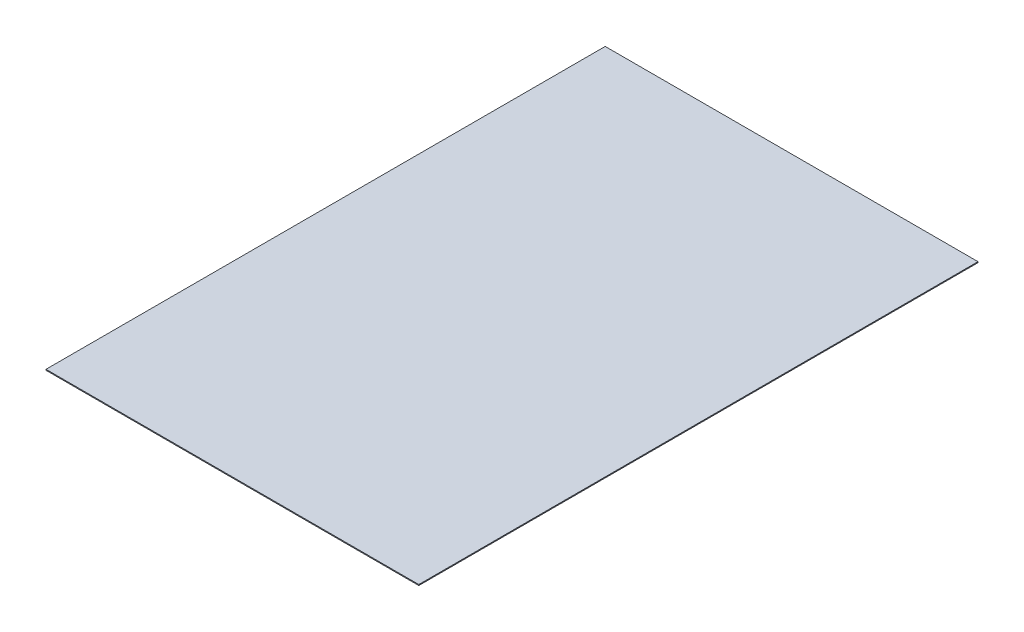
ISO-10303-21;
HEADER;
FILE_DESCRIPTION(('STEP AP214'),'2;1');
FILE_NAME('part.step','',(''),(''),'','','');
FILE_SCHEMA(('AUTOMOTIVE_DESIGN { 1 0 10303 214 1 1 1 1 }'));
ENDSEC;
DATA;
#1=APPLICATION_CONTEXT('core data for automotive mechanical design processes');
#2=APPLICATION_PROTOCOL_DEFINITION('international standard','automotive_design',2000,#1);
#3=PRODUCT_CONTEXT('',#1,'mechanical');
#4=PRODUCT('Part','Part','',(#3));
#5=PRODUCT_RELATED_PRODUCT_CATEGORY('part','',(#4));
#6=PRODUCT_DEFINITION_FORMATION('','',#4);
#7=PRODUCT_DEFINITION_CONTEXT('part definition',#1,'design');
#8=PRODUCT_DEFINITION('design','',#6,#7);
#9=PRODUCT_DEFINITION_SHAPE('','',#8);
#10=(LENGTH_UNIT() NAMED_UNIT(*) SI_UNIT(.MILLI.,.METRE.));
#11=(NAMED_UNIT(*) PLANE_ANGLE_UNIT() SI_UNIT($,.RADIAN.));
#12=(NAMED_UNIT(*) SI_UNIT($,.STERADIAN.) SOLID_ANGLE_UNIT());
#13=UNCERTAINTY_MEASURE_WITH_UNIT(LENGTH_MEASURE(1.E-05),#10,'distance_accuracy_value','');
#14=(GEOMETRIC_REPRESENTATION_CONTEXT(3) GLOBAL_UNCERTAINTY_ASSIGNED_CONTEXT((#13)) GLOBAL_UNIT_ASSIGNED_CONTEXT((#10,
#11,#12)) REPRESENTATION_CONTEXT('',''));
#15=CARTESIAN_POINT('',(0.,0.,0.));
#16=DIRECTION('',(0.,0.,1.));
#17=DIRECTION('',(1.,0.,0.));
#18=AXIS2_PLACEMENT_3D('',#15,#16,#17);
#19=CARTESIAN_POINT('',(-500.,2.5,750.));
#20=DIRECTION('',(0.,1.,0.));
#21=DIRECTION('',(1.,0.,0.));
#22=AXIS2_PLACEMENT_3D('',#19,#20,#21);
#23=PLANE('',#22);
#24=DIRECTION('',(0.,0.,1.));
#25=VECTOR('',#24,1.);
#26=CARTESIAN_POINT('',(4.20264305523982E-13,2.5,1500.));
#27=LINE('',#26,#25);
#28=CARTESIAN_POINT('',(0.,2.5,0.));
#29=VERTEX_POINT('',#28);
#30=CARTESIAN_POINT('',(4.20264305523982E-13,2.5,1500.));
#31=VERTEX_POINT('',#30);
#32=EDGE_CURVE('E108',#29,#31,#27,.T.);
#33=ORIENTED_EDGE('',*,*,#32,.F.);
#34=DIRECTION('',(1.,0.,0.));
#35=VECTOR('',#34,1.);
#36=CARTESIAN_POINT('',(0.,2.5,0.));
#37=LINE('',#36,#35);
#38=CARTESIAN_POINT('',(-1000.,2.5,0.));
#39=VERTEX_POINT('',#38);
#40=EDGE_CURVE('E28',#39,#29,#37,.T.);
#41=ORIENTED_EDGE('',*,*,#40,.F.);
#42=DIRECTION('',(0.,0.,-1.));
#43=VECTOR('',#42,1.);
#44=CARTESIAN_POINT('',(-1000.,2.5,0.));
#45=LINE('',#44,#43);
#46=CARTESIAN_POINT('',(-1000.,2.5,1500.));
#47=VERTEX_POINT('',#46);
#48=EDGE_CURVE('E74',#47,#39,#45,.T.);
#49=ORIENTED_EDGE('',*,*,#48,.F.);
#50=DIRECTION('',(-1.,0.,0.));
#51=VECTOR('',#50,1.);
#52=CARTESIAN_POINT('',(-1000.,2.5,1500.));
#53=LINE('',#52,#51);
#54=EDGE_CURVE('E77',#31,#47,#53,.T.);
#55=ORIENTED_EDGE('',*,*,#54,.F.);
#56=EDGE_LOOP('',(#33,#41,#49,#55));
#57=FACE_BOUND('',#56,.T.);
#58=ADVANCED_FACE('F17',(#57),#23,.T.);
#59=CARTESIAN_POINT('',(-500.,0.,750.));
#60=DIRECTION('',(0.,1.,0.));
#61=DIRECTION('',(1.,0.,0.));
#62=AXIS2_PLACEMENT_3D('',#59,#60,#61);
#63=PLANE('',#62);
#64=DIRECTION('',(-1.,0.,0.));
#65=VECTOR('',#64,1.);
#66=CARTESIAN_POINT('',(0.,0.,0.));
#67=LINE('',#66,#65);
#68=CARTESIAN_POINT('',(0.,0.,0.));
#69=VERTEX_POINT('',#68);
#70=CARTESIAN_POINT('',(-1000.,0.,0.));
#71=VERTEX_POINT('',#70);
#72=EDGE_CURVE('E11',#69,#71,#67,.T.);
#73=ORIENTED_EDGE('',*,*,#72,.F.);
#74=DIRECTION('',(0.,0.,-1.));
#75=VECTOR('',#74,1.);
#76=CARTESIAN_POINT('',(4.20264305523982E-13,0.,1500.));
#77=LINE('',#76,#75);
#78=CARTESIAN_POINT('',(4.20264305523982E-13,0.,1500.));
#79=VERTEX_POINT('',#78);
#80=EDGE_CURVE('E100',#79,#69,#77,.T.);
#81=ORIENTED_EDGE('',*,*,#80,.F.);
#82=DIRECTION('',(1.,0.,0.));
#83=VECTOR('',#82,1.);
#84=CARTESIAN_POINT('',(-1000.,0.,1500.));
#85=LINE('',#84,#83);
#86=CARTESIAN_POINT('',(-1000.,0.,1500.));
#87=VERTEX_POINT('',#86);
#88=EDGE_CURVE('E81',#87,#79,#85,.T.);
#89=ORIENTED_EDGE('',*,*,#88,.F.);
#90=DIRECTION('',(0.,0.,1.));
#91=VECTOR('',#90,1.);
#92=CARTESIAN_POINT('',(-1000.,0.,0.));
#93=LINE('',#92,#91);
#94=EDGE_CURVE('E67',#71,#87,#93,.T.);
#95=ORIENTED_EDGE('',*,*,#94,.F.);
#96=EDGE_LOOP('',(#73,#81,#89,#95));
#97=FACE_BOUND('',#96,.T.);
#98=ADVANCED_FACE('F125',(#97),#63,.F.);
#99=CARTESIAN_POINT('',(-1000.,0.,0.));
#100=DIRECTION('',(0.,0.,-1.));
#101=DIRECTION('',(0.,-1.,0.));
#102=AXIS2_PLACEMENT_3D('',#99,#100,#101);
#103=PLANE('',#102);
#104=ORIENTED_EDGE('',*,*,#40,.T.);
#105=DIRECTION('',(0.,1.,0.));
#106=VECTOR('',#105,1.);
#107=CARTESIAN_POINT('',(0.,0.,0.));
#108=LINE('',#107,#106);
#109=EDGE_CURVE('E93',#69,#29,#108,.T.);
#110=ORIENTED_EDGE('',*,*,#109,.F.);
#111=ORIENTED_EDGE('',*,*,#72,.T.);
#112=DIRECTION('',(0.,1.,0.));
#113=VECTOR('',#112,1.);
#114=CARTESIAN_POINT('',(-1000.,0.,0.));
#115=LINE('',#114,#113);
#116=EDGE_CURVE('E80',#71,#39,#115,.T.);
#117=ORIENTED_EDGE('',*,*,#116,.T.);
#118=EDGE_LOOP('',(#104,#110,#111,#117));
#119=FACE_BOUND('',#118,.T.);
#120=ADVANCED_FACE('F19',(#119),#103,.T.);
#121=CARTESIAN_POINT('',(-1000.,0.,1500.));
#122=DIRECTION('',(-1.,0.,0.));
#123=DIRECTION('',(0.,1.,0.));
#124=AXIS2_PLACEMENT_3D('',#121,#122,#123);
#125=PLANE('',#124);
#126=ORIENTED_EDGE('',*,*,#48,.T.);
#127=ORIENTED_EDGE('',*,*,#116,.F.);
#128=ORIENTED_EDGE('',*,*,#94,.T.);
#129=DIRECTION('',(0.,1.,0.));
#130=VECTOR('',#129,1.);
#131=CARTESIAN_POINT('',(-1000.,0.,1500.));
#132=LINE('',#131,#130);
#133=EDGE_CURVE('E84',#87,#47,#132,.T.);
#134=ORIENTED_EDGE('',*,*,#133,.T.);
#135=EDGE_LOOP('',(#126,#127,#128,#134));
#136=FACE_BOUND('',#135,.T.);
#137=ADVANCED_FACE('F85',(#136),#125,.T.);
#138=CARTESIAN_POINT('',(4.20264305523982E-13,0.,1500.));
#139=DIRECTION('',(0.,0.,1.));
#140=DIRECTION('',(1.,0.,0.));
#141=AXIS2_PLACEMENT_3D('',#138,#139,#140);
#142=PLANE('',#141);
#143=ORIENTED_EDGE('',*,*,#54,.T.);
#144=ORIENTED_EDGE('',*,*,#133,.F.);
#145=ORIENTED_EDGE('',*,*,#88,.T.);
#146=DIRECTION('',(0.,1.,0.));
#147=VECTOR('',#146,1.);
#148=CARTESIAN_POINT('',(4.20264305523982E-13,0.,1500.));
#149=LINE('',#148,#147);
#150=EDGE_CURVE('E21',#79,#31,#149,.T.);
#151=ORIENTED_EDGE('',*,*,#150,.T.);
#152=EDGE_LOOP('',(#143,#144,#145,#151));
#153=FACE_BOUND('',#152,.T.);
#154=ADVANCED_FACE('F89',(#153),#142,.T.);
#155=CARTESIAN_POINT('',(0.,0.,0.));
#156=DIRECTION('',(1.,0.,0.));
#157=DIRECTION('',(0.,0.,-1.));
#158=AXIS2_PLACEMENT_3D('',#155,#156,#157);
#159=PLANE('',#158);
#160=ORIENTED_EDGE('',*,*,#32,.T.);
#161=ORIENTED_EDGE('',*,*,#150,.F.);
#162=ORIENTED_EDGE('',*,*,#80,.T.);
#163=ORIENTED_EDGE('',*,*,#109,.T.);
#164=EDGE_LOOP('',(#160,#161,#162,#163));
#165=FACE_BOUND('',#164,.T.);
#166=ADVANCED_FACE('F122',(#165),#159,.T.);
#167=CLOSED_SHELL('',(#58,#98,#120,#137,#154,#166));
#168=MANIFOLD_SOLID_BREP('B1',#167);
#169=ADVANCED_BREP_SHAPE_REPRESENTATION('',(#18,#168),#14);
#170=SHAPE_DEFINITION_REPRESENTATION(#9,#169);
ENDSEC;
END-ISO-10303-21;
